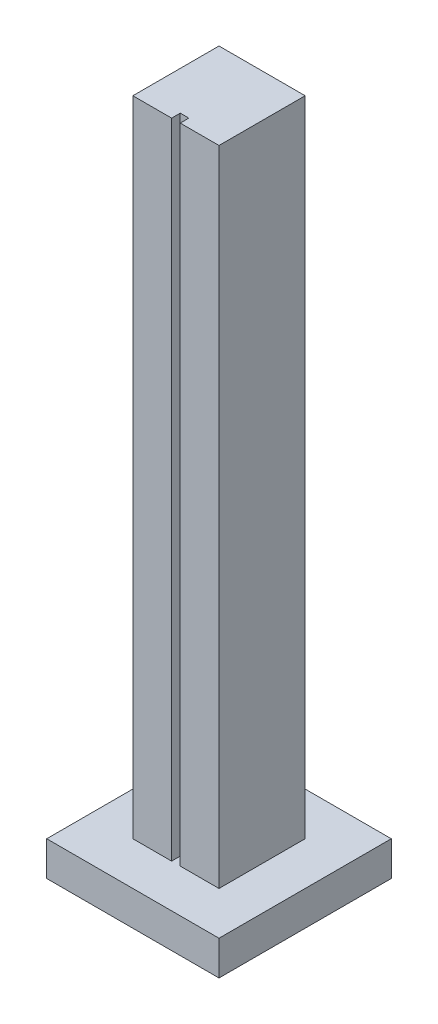
ISO-10303-21;
HEADER;
FILE_DESCRIPTION(('STEP AP214'),'2;1');
FILE_NAME('part.step','',(''),(''),'','','');
FILE_SCHEMA(('AUTOMOTIVE_DESIGN { 1 0 10303 214 1 1 1 1 }'));
ENDSEC;
DATA;
#1=APPLICATION_CONTEXT('core data for automotive mechanical design processes');
#2=APPLICATION_PROTOCOL_DEFINITION('international standard','automotive_design',2000,#1);
#3=PRODUCT_CONTEXT('',#1,'mechanical');
#4=PRODUCT('Part','Part','',(#3));
#5=PRODUCT_RELATED_PRODUCT_CATEGORY('part','',(#4));
#6=PRODUCT_DEFINITION_FORMATION('','',#4);
#7=PRODUCT_DEFINITION_CONTEXT('part definition',#1,'design');
#8=PRODUCT_DEFINITION('design','',#6,#7);
#9=PRODUCT_DEFINITION_SHAPE('','',#8);
#10=(LENGTH_UNIT() NAMED_UNIT(*) SI_UNIT(.MILLI.,.METRE.));
#11=(NAMED_UNIT(*) PLANE_ANGLE_UNIT() SI_UNIT($,.RADIAN.));
#12=(NAMED_UNIT(*) SI_UNIT($,.STERADIAN.) SOLID_ANGLE_UNIT());
#13=UNCERTAINTY_MEASURE_WITH_UNIT(LENGTH_MEASURE(1.E-05),#10,'distance_accuracy_value','');
#14=(GEOMETRIC_REPRESENTATION_CONTEXT(3) GLOBAL_UNCERTAINTY_ASSIGNED_CONTEXT((#13)) GLOBAL_UNIT_ASSIGNED_CONTEXT((#10,
#11,#12)) REPRESENTATION_CONTEXT('',''));
#15=CARTESIAN_POINT('',(0.,0.,0.));
#16=DIRECTION('',(0.,0.,1.));
#17=DIRECTION('',(1.,0.,0.));
#18=AXIS2_PLACEMENT_3D('',#15,#16,#17);
#19=CARTESIAN_POINT('',(0.,78.7,0.));
#20=DIRECTION('',(1.,0.,0.));
#21=DIRECTION('',(0.,0.,-1.));
#22=AXIS2_PLACEMENT_3D('',#19,#20,#21);
#23=PLANE('',#22);
#24=DIRECTION('',(0.,-1.,0.));
#25=VECTOR('',#24,1.);
#26=CARTESIAN_POINT('',(0.,78.7,-10.));
#27=LINE('',#26,#25);
#28=CARTESIAN_POINT('',(0.,78.7,-10.));
#29=VERTEX_POINT('',#28);
#30=CARTESIAN_POINT('',(0.,4.,-10.));
#31=VERTEX_POINT('',#30);
#32=EDGE_CURVE('E217',#29,#31,#27,.T.);
#33=ORIENTED_EDGE('',*,*,#32,.T.);
#34=DIRECTION('',(0.,0.,1.));
#35=VECTOR('',#34,1.);
#36=CARTESIAN_POINT('',(0.,4.,0.));
#37=LINE('',#36,#35);
#38=CARTESIAN_POINT('',(0.,4.,0.));
#39=VERTEX_POINT('',#38);
#40=EDGE_CURVE('E60',#31,#39,#37,.T.);
#41=ORIENTED_EDGE('',*,*,#40,.T.);
#42=DIRECTION('',(0.,-1.,0.));
#43=VECTOR('',#42,1.);
#44=CARTESIAN_POINT('',(0.,78.7,0.));
#45=LINE('',#44,#43);
#46=CARTESIAN_POINT('',(0.,78.7,0.));
#47=VERTEX_POINT('',#46);
#48=EDGE_CURVE('E53',#47,#39,#45,.T.);
#49=ORIENTED_EDGE('',*,*,#48,.F.);
#50=DIRECTION('',(0.,0.,1.));
#51=VECTOR('',#50,1.);
#52=CARTESIAN_POINT('',(0.,78.7,0.));
#53=LINE('',#52,#51);
#54=EDGE_CURVE('E194',#29,#47,#53,.T.);
#55=ORIENTED_EDGE('',*,*,#54,.F.);
#56=EDGE_LOOP('',(#33,#41,#49,#55));
#57=FACE_BOUND('',#56,.T.);
#58=ADVANCED_FACE('F45',(#57),#23,.F.);
#59=CARTESIAN_POINT('',(0.,78.7,0.));
#60=DIRECTION('',(0.,0.,-1.));
#61=DIRECTION('',(-1.,0.,0.));
#62=AXIS2_PLACEMENT_3D('',#59,#60,#61);
#63=PLANE('',#62);
#64=ORIENTED_EDGE('',*,*,#48,.T.);
#65=DIRECTION('',(1.,0.,0.));
#66=VECTOR('',#65,1.);
#67=CARTESIAN_POINT('',(0.,4.,0.));
#68=LINE('',#67,#66);
#69=CARTESIAN_POINT('',(4.5,4.,0.));
#70=VERTEX_POINT('',#69);
#71=EDGE_CURVE('E188',#39,#70,#68,.T.);
#72=ORIENTED_EDGE('',*,*,#71,.T.);
#73=DIRECTION('',(0.,-1.,0.));
#74=VECTOR('',#73,1.);
#75=CARTESIAN_POINT('',(4.5,78.7,0.));
#76=LINE('',#75,#74);
#77=CARTESIAN_POINT('',(4.5,78.7,0.));
#78=VERTEX_POINT('',#77);
#79=EDGE_CURVE('E241',#78,#70,#76,.T.);
#80=ORIENTED_EDGE('',*,*,#79,.F.);
#81=DIRECTION('',(1.,0.,0.));
#82=VECTOR('',#81,1.);
#83=CARTESIAN_POINT('',(0.,78.7,0.));
#84=LINE('',#83,#82);
#85=EDGE_CURVE('E197',#47,#78,#84,.T.);
#86=ORIENTED_EDGE('',*,*,#85,.F.);
#87=EDGE_LOOP('',(#64,#72,#80,#86));
#88=FACE_BOUND('',#87,.T.);
#89=ADVANCED_FACE('F248',(#88),#63,.F.);
#90=CARTESIAN_POINT('',(4.5,78.7,0.));
#91=DIRECTION('',(-1.,0.,0.));
#92=DIRECTION('',(0.,0.,1.));
#93=AXIS2_PLACEMENT_3D('',#90,#91,#92);
#94=PLANE('',#93);
#95=ORIENTED_EDGE('',*,*,#79,.T.);
#96=DIRECTION('',(0.,0.,-1.));
#97=VECTOR('',#96,1.);
#98=CARTESIAN_POINT('',(4.5,4.,0.));
#99=LINE('',#98,#97);
#100=CARTESIAN_POINT('',(4.5,4.,-1.));
#101=VERTEX_POINT('',#100);
#102=EDGE_CURVE('E184',#70,#101,#99,.T.);
#103=ORIENTED_EDGE('',*,*,#102,.T.);
#104=DIRECTION('',(0.,-1.,0.));
#105=VECTOR('',#104,1.);
#106=CARTESIAN_POINT('',(4.5,78.7,-1.));
#107=LINE('',#106,#105);
#108=CARTESIAN_POINT('',(4.5,78.7,-1.));
#109=VERTEX_POINT('',#108);
#110=EDGE_CURVE('E237',#109,#101,#107,.T.);
#111=ORIENTED_EDGE('',*,*,#110,.F.);
#112=DIRECTION('',(0.,0.,-1.));
#113=VECTOR('',#112,1.);
#114=CARTESIAN_POINT('',(4.5,78.7,0.));
#115=LINE('',#114,#113);
#116=EDGE_CURVE('E200',#78,#109,#115,.T.);
#117=ORIENTED_EDGE('',*,*,#116,.F.);
#118=EDGE_LOOP('',(#95,#103,#111,#117));
#119=FACE_BOUND('',#118,.T.);
#120=ADVANCED_FACE('F272',(#119),#94,.F.);
#121=CARTESIAN_POINT('',(4.5,78.7,-1.));
#122=DIRECTION('',(0.,0.,-1.));
#123=DIRECTION('',(-1.,0.,0.));
#124=AXIS2_PLACEMENT_3D('',#121,#122,#123);
#125=PLANE('',#124);
#126=ORIENTED_EDGE('',*,*,#110,.T.);
#127=DIRECTION('',(1.,0.,0.));
#128=VECTOR('',#127,1.);
#129=CARTESIAN_POINT('',(4.5,4.,-1.));
#130=LINE('',#129,#128);
#131=CARTESIAN_POINT('',(5.5,4.,-1.));
#132=VERTEX_POINT('',#131);
#133=EDGE_CURVE('E180',#101,#132,#130,.T.);
#134=ORIENTED_EDGE('',*,*,#133,.T.);
#135=DIRECTION('',(0.,-1.,0.));
#136=VECTOR('',#135,1.);
#137=CARTESIAN_POINT('',(5.5,78.7,-1.));
#138=LINE('',#137,#136);
#139=CARTESIAN_POINT('',(5.5,78.7,-1.));
#140=VERTEX_POINT('',#139);
#141=EDGE_CURVE('E233',#140,#132,#138,.T.);
#142=ORIENTED_EDGE('',*,*,#141,.F.);
#143=DIRECTION('',(1.,0.,0.));
#144=VECTOR('',#143,1.);
#145=CARTESIAN_POINT('',(4.5,78.7,-1.));
#146=LINE('',#145,#144);
#147=EDGE_CURVE('E203',#109,#140,#146,.T.);
#148=ORIENTED_EDGE('',*,*,#147,.F.);
#149=EDGE_LOOP('',(#126,#134,#142,#148));
#150=FACE_BOUND('',#149,.T.);
#151=ADVANCED_FACE('F269',(#150),#125,.F.);
#152=CARTESIAN_POINT('',(5.5,78.7,-1.));
#153=DIRECTION('',(1.,0.,0.));
#154=DIRECTION('',(0.,0.,-1.));
#155=AXIS2_PLACEMENT_3D('',#152,#153,#154);
#156=PLANE('',#155);
#157=ORIENTED_EDGE('',*,*,#141,.T.);
#158=DIRECTION('',(0.,0.,1.));
#159=VECTOR('',#158,1.);
#160=CARTESIAN_POINT('',(5.5,4.,-1.));
#161=LINE('',#160,#159);
#162=CARTESIAN_POINT('',(5.5,4.,0.));
#163=VERTEX_POINT('',#162);
#164=EDGE_CURVE('E176',#132,#163,#161,.T.);
#165=ORIENTED_EDGE('',*,*,#164,.T.);
#166=DIRECTION('',(0.,-1.,0.));
#167=VECTOR('',#166,1.);
#168=CARTESIAN_POINT('',(5.5,78.7,0.));
#169=LINE('',#168,#167);
#170=CARTESIAN_POINT('',(5.5,78.7,0.));
#171=VERTEX_POINT('',#170);
#172=EDGE_CURVE('E229',#171,#163,#169,.T.);
#173=ORIENTED_EDGE('',*,*,#172,.F.);
#174=DIRECTION('',(0.,0.,1.));
#175=VECTOR('',#174,1.);
#176=CARTESIAN_POINT('',(5.5,78.7,-1.));
#177=LINE('',#176,#175);
#178=EDGE_CURVE('E206',#140,#171,#177,.T.);
#179=ORIENTED_EDGE('',*,*,#178,.F.);
#180=EDGE_LOOP('',(#157,#165,#173,#179));
#181=FACE_BOUND('',#180,.T.);
#182=ADVANCED_FACE('F264',(#181),#156,.F.);
#183=CARTESIAN_POINT('',(5.5,78.7,0.));
#184=DIRECTION('',(0.,0.,-1.));
#185=DIRECTION('',(-1.,0.,0.));
#186=AXIS2_PLACEMENT_3D('',#183,#184,#185);
#187=PLANE('',#186);
#188=ORIENTED_EDGE('',*,*,#172,.T.);
#189=DIRECTION('',(1.,0.,0.));
#190=VECTOR('',#189,1.);
#191=CARTESIAN_POINT('',(5.5,4.,0.));
#192=LINE('',#191,#190);
#193=CARTESIAN_POINT('',(10.,4.,0.));
#194=VERTEX_POINT('',#193);
#195=EDGE_CURVE('E167',#163,#194,#192,.T.);
#196=ORIENTED_EDGE('',*,*,#195,.T.);
#197=DIRECTION('',(0.,-1.,0.));
#198=VECTOR('',#197,1.);
#199=CARTESIAN_POINT('',(10.,78.7,0.));
#200=LINE('',#199,#198);
#201=CARTESIAN_POINT('',(10.,78.7,0.));
#202=VERTEX_POINT('',#201);
#203=EDGE_CURVE('E225',#202,#194,#200,.T.);
#204=ORIENTED_EDGE('',*,*,#203,.F.);
#205=DIRECTION('',(1.,0.,0.));
#206=VECTOR('',#205,1.);
#207=CARTESIAN_POINT('',(5.5,78.7,0.));
#208=LINE('',#207,#206);
#209=EDGE_CURVE('E209',#171,#202,#208,.T.);
#210=ORIENTED_EDGE('',*,*,#209,.F.);
#211=EDGE_LOOP('',(#188,#196,#204,#210));
#212=FACE_BOUND('',#211,.T.);
#213=ADVANCED_FACE('F261',(#212),#187,.F.);
#214=CARTESIAN_POINT('',(10.,78.7,0.));
#215=DIRECTION('',(-1.,0.,0.));
#216=DIRECTION('',(0.,0.,1.));
#217=AXIS2_PLACEMENT_3D('',#214,#215,#216);
#218=PLANE('',#217);
#219=ORIENTED_EDGE('',*,*,#203,.T.);
#220=DIRECTION('',(0.,0.,-1.));
#221=VECTOR('',#220,1.);
#222=CARTESIAN_POINT('',(10.,4.,0.));
#223=LINE('',#222,#221);
#224=CARTESIAN_POINT('',(10.,4.,-10.));
#225=VERTEX_POINT('',#224);
#226=EDGE_CURVE('E162',#194,#225,#223,.T.);
#227=ORIENTED_EDGE('',*,*,#226,.T.);
#228=DIRECTION('',(0.,-1.,0.));
#229=VECTOR('',#228,1.);
#230=CARTESIAN_POINT('',(10.,78.7,-10.));
#231=LINE('',#230,#229);
#232=CARTESIAN_POINT('',(10.,78.7,-10.));
#233=VERTEX_POINT('',#232);
#234=EDGE_CURVE('E221',#233,#225,#231,.T.);
#235=ORIENTED_EDGE('',*,*,#234,.F.);
#236=DIRECTION('',(0.,0.,-1.));
#237=VECTOR('',#236,1.);
#238=CARTESIAN_POINT('',(10.,78.7,0.));
#239=LINE('',#238,#237);
#240=EDGE_CURVE('E212',#202,#233,#239,.T.);
#241=ORIENTED_EDGE('',*,*,#240,.F.);
#242=EDGE_LOOP('',(#219,#227,#235,#241));
#243=FACE_BOUND('',#242,.T.);
#244=ADVANCED_FACE('F256',(#243),#218,.F.);
#245=CARTESIAN_POINT('',(0.,78.7,-10.));
#246=DIRECTION('',(0.,0.,1.));
#247=DIRECTION('',(1.,0.,0.));
#248=AXIS2_PLACEMENT_3D('',#245,#246,#247);
#249=PLANE('',#248);
#250=ORIENTED_EDGE('',*,*,#234,.T.);
#251=DIRECTION('',(-1.,0.,0.));
#252=VECTOR('',#251,1.);
#253=CARTESIAN_POINT('',(0.,4.,-10.));
#254=LINE('',#253,#252);
#255=EDGE_CURVE('E11',#225,#31,#254,.T.);
#256=ORIENTED_EDGE('',*,*,#255,.T.);
#257=ORIENTED_EDGE('',*,*,#32,.F.);
#258=DIRECTION('',(-1.,0.,0.));
#259=VECTOR('',#258,1.);
#260=CARTESIAN_POINT('',(0.,78.7,-10.));
#261=LINE('',#260,#259);
#262=EDGE_CURVE('E67',#233,#29,#261,.T.);
#263=ORIENTED_EDGE('',*,*,#262,.F.);
#264=EDGE_LOOP('',(#250,#256,#257,#263));
#265=FACE_BOUND('',#264,.T.);
#266=ADVANCED_FACE('F253',(#265),#249,.F.);
#267=CARTESIAN_POINT('',(0.,78.7,0.));
#268=DIRECTION('',(0.,-1.,0.));
#269=DIRECTION('',(0.,0.,-1.));
#270=AXIS2_PLACEMENT_3D('',#267,#268,#269);
#271=PLANE('',#270);
#272=ORIENTED_EDGE('',*,*,#54,.T.);
#273=ORIENTED_EDGE('',*,*,#85,.T.);
#274=ORIENTED_EDGE('',*,*,#116,.T.);
#275=ORIENTED_EDGE('',*,*,#147,.T.);
#276=ORIENTED_EDGE('',*,*,#178,.T.);
#277=ORIENTED_EDGE('',*,*,#209,.T.);
#278=ORIENTED_EDGE('',*,*,#240,.T.);
#279=ORIENTED_EDGE('',*,*,#262,.T.);
#280=EDGE_LOOP('',(#272,#273,#274,#275,#276,#277,#278,#279));
#281=FACE_BOUND('',#280,.T.);
#282=ADVANCED_FACE('F274',(#281),#271,.F.);
#283=CARTESIAN_POINT('',(0.,4.,0.));
#284=DIRECTION('',(0.,1.,0.));
#285=DIRECTION('',(0.,0.,1.));
#286=AXIS2_PLACEMENT_3D('',#283,#284,#285);
#287=PLANE('',#286);
#288=DIRECTION('',(0.,0.,1.));
#289=VECTOR('',#288,1.);
#290=CARTESIAN_POINT('',(-5.,4.,-15.));
#291=LINE('',#290,#289);
#292=CARTESIAN_POINT('',(-5.,4.,-15.));
#293=VERTEX_POINT('',#292);
#294=CARTESIAN_POINT('',(-5.,4.,5.));
#295=VERTEX_POINT('',#294);
#296=EDGE_CURVE('E146',#293,#295,#291,.T.);
#297=ORIENTED_EDGE('',*,*,#296,.T.);
#298=DIRECTION('',(1.,0.,0.));
#299=VECTOR('',#298,1.);
#300=CARTESIAN_POINT('',(-5.,4.,5.));
#301=LINE('',#300,#299);
#302=CARTESIAN_POINT('',(15.,4.,5.));
#303=VERTEX_POINT('',#302);
#304=EDGE_CURVE('E134',#295,#303,#301,.T.);
#305=ORIENTED_EDGE('',*,*,#304,.T.);
#306=DIRECTION('',(0.,0.,-1.));
#307=VECTOR('',#306,1.);
#308=CARTESIAN_POINT('',(15.,4.,-15.));
#309=LINE('',#308,#307);
#310=CARTESIAN_POINT('',(15.,4.,-15.));
#311=VERTEX_POINT('',#310);
#312=EDGE_CURVE('E145',#303,#311,#309,.T.);
#313=ORIENTED_EDGE('',*,*,#312,.T.);
#314=DIRECTION('',(-1.,0.,0.));
#315=VECTOR('',#314,1.);
#316=CARTESIAN_POINT('',(-5.,4.,-15.));
#317=LINE('',#316,#315);
#318=EDGE_CURVE('E151',#311,#293,#317,.T.);
#319=ORIENTED_EDGE('',*,*,#318,.T.);
#320=EDGE_LOOP('',(#297,#305,#313,#319));
#321=FACE_BOUND('',#320,.T.);
#322=ORIENTED_EDGE('',*,*,#40,.F.);
#323=ORIENTED_EDGE('',*,*,#255,.F.);
#324=ORIENTED_EDGE('',*,*,#226,.F.);
#325=ORIENTED_EDGE('',*,*,#195,.F.);
#326=ORIENTED_EDGE('',*,*,#164,.F.);
#327=ORIENTED_EDGE('',*,*,#133,.F.);
#328=ORIENTED_EDGE('',*,*,#102,.F.);
#329=ORIENTED_EDGE('',*,*,#71,.F.);
#330=EDGE_LOOP('',(#322,#323,#324,#325,#326,#327,#328,#329));
#331=FACE_BOUND('',#330,.T.);
#332=ADVANCED_FACE('F149',(#321,#331),#287,.T.);
#333=CARTESIAN_POINT('',(-5.,4.,-15.));
#334=DIRECTION('',(1.,0.,0.));
#335=DIRECTION('',(0.,0.,-1.));
#336=AXIS2_PLACEMENT_3D('',#333,#334,#335);
#337=PLANE('',#336);
#338=DIRECTION('',(0.,0.,1.));
#339=VECTOR('',#338,1.);
#340=CARTESIAN_POINT('',(-5.,0.,-15.));
#341=LINE('',#340,#339);
#342=CARTESIAN_POINT('',(-5.,0.,-15.));
#343=VERTEX_POINT('',#342);
#344=CARTESIAN_POINT('',(-5.,0.,5.));
#345=VERTEX_POINT('',#344);
#346=EDGE_CURVE('E160',#343,#345,#341,.T.);
#347=ORIENTED_EDGE('',*,*,#346,.T.);
#348=DIRECTION('',(0.,-1.,0.));
#349=VECTOR('',#348,1.);
#350=CARTESIAN_POINT('',(-5.,4.,5.));
#351=LINE('',#350,#349);
#352=EDGE_CURVE('E138',#295,#345,#351,.T.);
#353=ORIENTED_EDGE('',*,*,#352,.F.);
#354=ORIENTED_EDGE('',*,*,#296,.F.);
#355=DIRECTION('',(0.,-1.,0.));
#356=VECTOR('',#355,1.);
#357=CARTESIAN_POINT('',(-5.,4.,-15.));
#358=LINE('',#357,#356);
#359=EDGE_CURVE('E326',#293,#343,#358,.T.);
#360=ORIENTED_EDGE('',*,*,#359,.T.);
#361=EDGE_LOOP('',(#347,#353,#354,#360));
#362=FACE_BOUND('',#361,.T.);
#363=ADVANCED_FACE('F158',(#362),#337,.F.);
#364=CARTESIAN_POINT('',(-5.,4.,5.));
#365=DIRECTION('',(0.,0.,-1.));
#366=DIRECTION('',(-1.,0.,0.));
#367=AXIS2_PLACEMENT_3D('',#364,#365,#366);
#368=PLANE('',#367);
#369=DIRECTION('',(1.,0.,0.));
#370=VECTOR('',#369,1.);
#371=CARTESIAN_POINT('',(-5.,0.,5.));
#372=LINE('',#371,#370);
#373=CARTESIAN_POINT('',(15.,0.,5.));
#374=VERTEX_POINT('',#373);
#375=EDGE_CURVE('E313',#345,#374,#372,.T.);
#376=ORIENTED_EDGE('',*,*,#375,.T.);
#377=DIRECTION('',(0.,-1.,0.));
#378=VECTOR('',#377,1.);
#379=CARTESIAN_POINT('',(15.,4.,5.));
#380=LINE('',#379,#378);
#381=EDGE_CURVE('E141',#303,#374,#380,.T.);
#382=ORIENTED_EDGE('',*,*,#381,.F.);
#383=ORIENTED_EDGE('',*,*,#304,.F.);
#384=ORIENTED_EDGE('',*,*,#352,.T.);
#385=EDGE_LOOP('',(#376,#382,#383,#384));
#386=FACE_BOUND('',#385,.T.);
#387=ADVANCED_FACE('F136',(#386),#368,.F.);
#388=CARTESIAN_POINT('',(15.,4.,-15.));
#389=DIRECTION('',(-1.,0.,0.));
#390=DIRECTION('',(0.,0.,1.));
#391=AXIS2_PLACEMENT_3D('',#388,#389,#390);
#392=PLANE('',#391);
#393=DIRECTION('',(0.,0.,-1.));
#394=VECTOR('',#393,1.);
#395=CARTESIAN_POINT('',(15.,0.,-15.));
#396=LINE('',#395,#394);
#397=CARTESIAN_POINT('',(15.,0.,-15.));
#398=VERTEX_POINT('',#397);
#399=EDGE_CURVE('E317',#374,#398,#396,.T.);
#400=ORIENTED_EDGE('',*,*,#399,.T.);
#401=DIRECTION('',(0.,-1.,0.));
#402=VECTOR('',#401,1.);
#403=CARTESIAN_POINT('',(15.,4.,-15.));
#404=LINE('',#403,#402);
#405=EDGE_CURVE('E169',#311,#398,#404,.T.);
#406=ORIENTED_EDGE('',*,*,#405,.F.);
#407=ORIENTED_EDGE('',*,*,#312,.F.);
#408=ORIENTED_EDGE('',*,*,#381,.T.);
#409=EDGE_LOOP('',(#400,#406,#407,#408));
#410=FACE_BOUND('',#409,.T.);
#411=ADVANCED_FACE('F308',(#410),#392,.F.);
#412=CARTESIAN_POINT('',(-5.,4.,-15.));
#413=DIRECTION('',(0.,0.,1.));
#414=DIRECTION('',(1.,0.,0.));
#415=AXIS2_PLACEMENT_3D('',#412,#413,#414);
#416=PLANE('',#415);
#417=DIRECTION('',(-1.,0.,0.));
#418=VECTOR('',#417,1.);
#419=CARTESIAN_POINT('',(-5.,0.,-15.));
#420=LINE('',#419,#418);
#421=EDGE_CURVE('E156',#398,#343,#420,.T.);
#422=ORIENTED_EDGE('',*,*,#421,.T.);
#423=ORIENTED_EDGE('',*,*,#359,.F.);
#424=ORIENTED_EDGE('',*,*,#318,.F.);
#425=ORIENTED_EDGE('',*,*,#405,.T.);
#426=EDGE_LOOP('',(#422,#423,#424,#425));
#427=FACE_BOUND('',#426,.T.);
#428=ADVANCED_FACE('F303',(#427),#416,.F.);
#429=CARTESIAN_POINT('',(0.,0.,0.));
#430=DIRECTION('',(0.,-1.,0.));
#431=DIRECTION('',(0.,0.,-1.));
#432=AXIS2_PLACEMENT_3D('',#429,#430,#431);
#433=PLANE('',#432);
#434=ORIENTED_EDGE('',*,*,#346,.F.);
#435=ORIENTED_EDGE('',*,*,#421,.F.);
#436=ORIENTED_EDGE('',*,*,#399,.F.);
#437=ORIENTED_EDGE('',*,*,#375,.F.);
#438=EDGE_LOOP('',(#434,#435,#436,#437));
#439=FACE_BOUND('',#438,.T.);
#440=ADVANCED_FACE('F301',(#439),#433,.T.);
#441=CLOSED_SHELL('',(#58,#89,#120,#151,#182,#213,#244,#266,#282,#332,#363,#387,#411,#428,#440));
#442=MANIFOLD_SOLID_BREP('B2',#441);
#443=ADVANCED_BREP_SHAPE_REPRESENTATION('',(#18,#442),#14);
#444=SHAPE_DEFINITION_REPRESENTATION(#9,#443);
ENDSEC;
END-ISO-10303-21;
